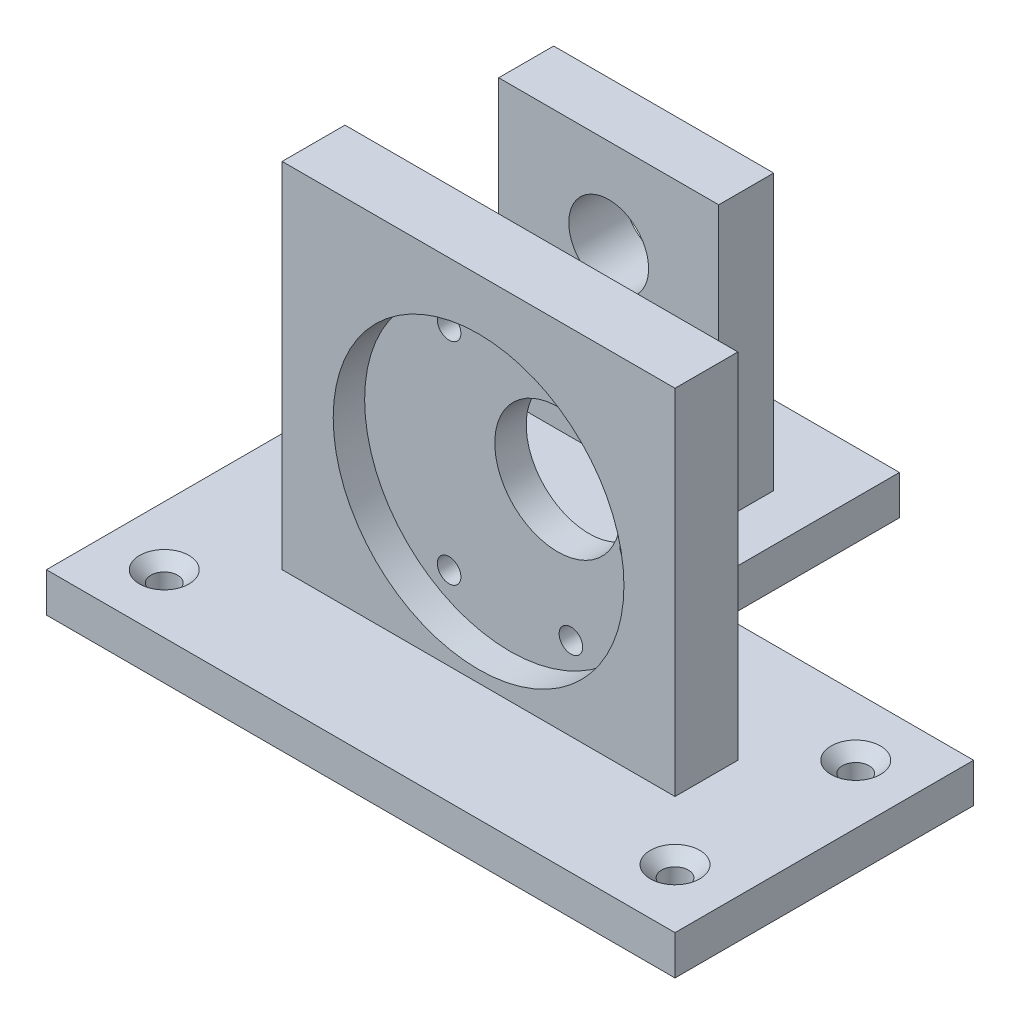
ISO-10303-21;
HEADER;
FILE_DESCRIPTION(('STEP AP214'),'2;1');
FILE_NAME('part.step','',(''),(''),'','','');
FILE_SCHEMA(('AUTOMOTIVE_DESIGN { 1 0 10303 214 1 1 1 1 }'));
ENDSEC;
DATA;
#1=APPLICATION_CONTEXT('core data for automotive mechanical design processes');
#2=APPLICATION_PROTOCOL_DEFINITION('international standard','automotive_design',2000,#1);
#3=PRODUCT_CONTEXT('',#1,'mechanical');
#4=PRODUCT('Part','Part','',(#3));
#5=PRODUCT_RELATED_PRODUCT_CATEGORY('part','',(#4));
#6=PRODUCT_DEFINITION_FORMATION('','',#4);
#7=PRODUCT_DEFINITION_CONTEXT('part definition',#1,'design');
#8=PRODUCT_DEFINITION('design','',#6,#7);
#9=PRODUCT_DEFINITION_SHAPE('','',#8);
#10=(LENGTH_UNIT() NAMED_UNIT(*) SI_UNIT(.MILLI.,.METRE.));
#11=(NAMED_UNIT(*) PLANE_ANGLE_UNIT() SI_UNIT($,.RADIAN.));
#12=(NAMED_UNIT(*) SI_UNIT($,.STERADIAN.) SOLID_ANGLE_UNIT());
#13=UNCERTAINTY_MEASURE_WITH_UNIT(LENGTH_MEASURE(1.E-05),#10,'distance_accuracy_value','');
#14=(GEOMETRIC_REPRESENTATION_CONTEXT(3) GLOBAL_UNCERTAINTY_ASSIGNED_CONTEXT((#13)) GLOBAL_UNIT_ASSIGNED_CONTEXT((#10,
#11,#12)) REPRESENTATION_CONTEXT('',''));
#15=CARTESIAN_POINT('',(0.,0.,0.));
#16=DIRECTION('',(0.,0.,1.));
#17=DIRECTION('',(1.,0.,0.));
#18=AXIS2_PLACEMENT_3D('',#15,#16,#17);
#19=CARTESIAN_POINT('',(0.,0.,-15.));
#20=DIRECTION('',(0.,0.,1.));
#21=DIRECTION('',(1.,0.,0.));
#22=AXIS2_PLACEMENT_3D('',#19,#20,#21);
#23=PLANE('',#22);
#24=DIRECTION('',(0.,-1.,0.));
#25=VECTOR('',#24,1.);
#26=CARTESIAN_POINT('',(3.56217782532956,0.,-15.));
#27=LINE('',#26,#25);
#28=CARTESIAN_POINT('',(3.56217782532956,5.00000000000001,-15.));
#29=VERTEX_POINT('',#28);
#30=CARTESIAN_POINT('',(3.56217782532956,0.,-15.));
#31=VERTEX_POINT('',#30);
#32=EDGE_CURVE('E235',#29,#31,#27,.T.);
#33=ORIENTED_EDGE('',*,*,#32,.F.);
#34=DIRECTION('',(-1.,0.,0.));
#35=VECTOR('',#34,1.);
#36=CARTESIAN_POINT('',(-40.,5.,-15.));
#37=LINE('',#36,#35);
#38=CARTESIAN_POINT('',(40.,5.00000000000002,-15.));
#39=VERTEX_POINT('',#38);
#40=EDGE_CURVE('E324',#39,#29,#37,.T.);
#41=ORIENTED_EDGE('',*,*,#40,.F.);
#42=DIRECTION('',(0.,1.,0.));
#43=VECTOR('',#42,1.);
#44=CARTESIAN_POINT('',(40.,5.00000000000002,-15.));
#45=LINE('',#44,#43);
#46=CARTESIAN_POINT('',(40.,0.,-15.));
#47=VERTEX_POINT('',#46);
#48=EDGE_CURVE('E319',#47,#39,#45,.T.);
#49=ORIENTED_EDGE('',*,*,#48,.F.);
#50=DIRECTION('',(1.,0.,0.));
#51=VECTOR('',#50,1.);
#52=CARTESIAN_POINT('',(-40.,0.,-15.));
#53=LINE('',#52,#51);
#54=EDGE_CURVE('E314',#31,#47,#53,.T.);
#55=ORIENTED_EDGE('',*,*,#54,.F.);
#56=EDGE_LOOP('',(#33,#41,#49,#55));
#57=FACE_BOUND('',#56,.T.);
#58=ADVANCED_FACE('F66',(#57),#23,.F.);
#59=CARTESIAN_POINT('',(-25.,50.,8.));
#60=DIRECTION('',(1.,0.,0.));
#61=DIRECTION('',(0.,1.,0.));
#62=AXIS2_PLACEMENT_3D('',#59,#60,#61);
#63=PLANE('',#62);
#64=DIRECTION('',(0.,0.,-1.));
#65=VECTOR('',#64,1.);
#66=CARTESIAN_POINT('',(-25.,5.,8.));
#67=LINE('',#66,#65);
#68=CARTESIAN_POINT('',(-25.,5.,8.));
#69=VERTEX_POINT('',#68);
#70=CARTESIAN_POINT('',(-25.,5.,0.));
#71=VERTEX_POINT('',#70);
#72=EDGE_CURVE('E359',#69,#71,#67,.T.);
#73=ORIENTED_EDGE('',*,*,#72,.F.);
#74=DIRECTION('',(0.,-1.,0.));
#75=VECTOR('',#74,1.);
#76=CARTESIAN_POINT('',(-25.,50.,8.));
#77=LINE('',#76,#75);
#78=CARTESIAN_POINT('',(-25.,50.,8.));
#79=VERTEX_POINT('',#78);
#80=EDGE_CURVE('E428',#79,#69,#77,.T.);
#81=ORIENTED_EDGE('',*,*,#80,.F.);
#82=DIRECTION('',(0.,0.,-1.));
#83=VECTOR('',#82,1.);
#84=CARTESIAN_POINT('',(-25.,50.,8.));
#85=LINE('',#84,#83);
#86=CARTESIAN_POINT('',(-25.,50.,0.));
#87=VERTEX_POINT('',#86);
#88=EDGE_CURVE('E443',#79,#87,#85,.T.);
#89=ORIENTED_EDGE('',*,*,#88,.T.);
#90=DIRECTION('',(0.,-1.,0.));
#91=VECTOR('',#90,1.);
#92=CARTESIAN_POINT('',(-25.,50.,0.));
#93=LINE('',#92,#91);
#94=EDGE_CURVE('E424',#87,#71,#93,.T.);
#95=ORIENTED_EDGE('',*,*,#94,.T.);
#96=EDGE_LOOP('',(#73,#81,#89,#95));
#97=FACE_BOUND('',#96,.T.);
#98=ADVANCED_FACE('F460',(#97),#63,.F.);
#99=CARTESIAN_POINT('',(25.,50.,8.));
#100=DIRECTION('',(1.,0.,0.));
#101=DIRECTION('',(0.,1.,0.));
#102=AXIS2_PLACEMENT_3D('',#99,#100,#101);
#103=PLANE('',#102);
#104=DIRECTION('',(0.,-1.,0.));
#105=VECTOR('',#104,1.);
#106=CARTESIAN_POINT('',(25.,50.,8.));
#107=LINE('',#106,#105);
#108=CARTESIAN_POINT('',(25.,50.,8.));
#109=VERTEX_POINT('',#108);
#110=CARTESIAN_POINT('',(25.,5.00000000000001,8.));
#111=VERTEX_POINT('',#110);
#112=EDGE_CURVE('E423',#109,#111,#107,.T.);
#113=ORIENTED_EDGE('',*,*,#112,.T.);
#114=DIRECTION('',(0.,0.,-1.));
#115=VECTOR('',#114,1.);
#116=CARTESIAN_POINT('',(25.,5.00000000000001,8.));
#117=LINE('',#116,#115);
#118=CARTESIAN_POINT('',(25.,5.00000000000001,0.));
#119=VERTEX_POINT('',#118);
#120=EDGE_CURVE('E355',#111,#119,#117,.T.);
#121=ORIENTED_EDGE('',*,*,#120,.T.);
#122=DIRECTION('',(0.,-1.,0.));
#123=VECTOR('',#122,1.);
#124=CARTESIAN_POINT('',(25.,50.,0.));
#125=LINE('',#124,#123);
#126=CARTESIAN_POINT('',(25.,50.,0.));
#127=VERTEX_POINT('',#126);
#128=EDGE_CURVE('E436',#127,#119,#125,.T.);
#129=ORIENTED_EDGE('',*,*,#128,.F.);
#130=DIRECTION('',(0.,0.,-1.));
#131=VECTOR('',#130,1.);
#132=CARTESIAN_POINT('',(25.,50.,8.));
#133=LINE('',#132,#131);
#134=EDGE_CURVE('E432',#109,#127,#133,.T.);
#135=ORIENTED_EDGE('',*,*,#134,.F.);
#136=EDGE_LOOP('',(#113,#121,#129,#135));
#137=FACE_BOUND('',#136,.T.);
#138=ADVANCED_FACE('F466',(#137),#103,.T.);
#139=CARTESIAN_POINT('',(0.,0.,8.));
#140=DIRECTION('',(0.,0.,-1.));
#141=DIRECTION('',(-1.,0.,0.));
#142=AXIS2_PLACEMENT_3D('',#139,#140,#141);
#143=PLANE('',#142);
#144=CARTESIAN_POINT('',(0.,25.,8.));
#145=DIRECTION('',(0.,0.,1.));
#146=DIRECTION('',(1.,0.,0.));
#147=AXIS2_PLACEMENT_3D('',#144,#145,#146);
#148=CIRCLE('',#147,18.5);
#149=CARTESIAN_POINT('',(18.5,25.,8.));
#150=VERTEX_POINT('',#149);
#151=EDGE_CURVE('E365',#150,#150,#148,.T.);
#152=ORIENTED_EDGE('',*,*,#151,.F.);
#153=EDGE_LOOP('',(#152));
#154=FACE_BOUND('',#153,.T.);
#155=DIRECTION('',(-1.,0.,0.));
#156=VECTOR('',#155,1.);
#157=CARTESIAN_POINT('',(0.,5.00000000000001,8.));
#158=LINE('',#157,#156);
#159=EDGE_CURVE('E362',#111,#69,#158,.T.);
#160=ORIENTED_EDGE('',*,*,#159,.F.);
#161=ORIENTED_EDGE('',*,*,#112,.F.);
#162=DIRECTION('',(1.,0.,0.));
#163=VECTOR('',#162,1.);
#164=CARTESIAN_POINT('',(-25.,50.,8.));
#165=LINE('',#164,#163);
#166=EDGE_CURVE('E419',#79,#109,#165,.T.);
#167=ORIENTED_EDGE('',*,*,#166,.F.);
#168=ORIENTED_EDGE('',*,*,#80,.T.);
#169=EDGE_LOOP('',(#160,#161,#167,#168));
#170=FACE_BOUND('',#169,.T.);
#171=ADVANCED_FACE('F469',(#154,#170),#143,.F.);
#172=CARTESIAN_POINT('',(0.,0.,0.));
#173=DIRECTION('',(0.,0.,-1.));
#174=DIRECTION('',(-1.,0.,0.));
#175=AXIS2_PLACEMENT_3D('',#172,#173,#174);
#176=PLANE('',#175);
#177=CARTESIAN_POINT('',(-16.4378221746704,28.4999999993294,0.));
#178=DIRECTION('',(0.,0.,-1.));
#179=DIRECTION('',(-1.,0.,0.));
#180=AXIS2_PLACEMENT_3D('',#177,#178,#179);
#181=CIRCLE('',#180,6.08);
#182=CARTESIAN_POINT('',(-22.5178221746704,28.4999999993294,0.));
#183=VERTEX_POINT('',#182);
#184=EDGE_CURVE('E254',#183,#183,#181,.T.);
#185=ORIENTED_EDGE('',*,*,#184,.F.);
#186=EDGE_LOOP('',(#185));
#187=FACE_BOUND('',#186,.T.);
#188=CARTESIAN_POINT('',(-7.74999999999999,38.4233937586588,0.));
#189=DIRECTION('',(0.,0.,1.));
#190=DIRECTION('',(1.,0.,0.));
#191=AXIS2_PLACEMENT_3D('',#188,#189,#190);
#192=CIRCLE('',#191,1.50000000039213);
#193=CARTESIAN_POINT('',(-6.24999999960786,38.4233937586588,0.));
#194=VERTEX_POINT('',#193);
#195=EDGE_CURVE('E399',#194,#194,#192,.T.);
#196=ORIENTED_EDGE('',*,*,#195,.T.);
#197=EDGE_LOOP('',(#196));
#198=FACE_BOUND('',#197,.T.);
#199=CARTESIAN_POINT('',(-7.74999999999999,11.5766062413412,0.));
#200=DIRECTION('',(0.,0.,1.));
#201=DIRECTION('',(1.,0.,0.));
#202=AXIS2_PLACEMENT_3D('',#199,#200,#201);
#203=CIRCLE('',#202,1.50000000039213);
#204=CARTESIAN_POINT('',(-6.24999999960786,11.5766062413412,0.));
#205=VERTEX_POINT('',#204);
#206=EDGE_CURVE('E404',#205,#205,#203,.T.);
#207=ORIENTED_EDGE('',*,*,#206,.T.);
#208=EDGE_LOOP('',(#207));
#209=FACE_BOUND('',#208,.T.);
#210=CARTESIAN_POINT('',(7.75000000000001,11.5766062413412,0.));
#211=DIRECTION('',(0.,0.,1.));
#212=DIRECTION('',(1.,0.,0.));
#213=AXIS2_PLACEMENT_3D('',#210,#211,#212);
#214=CIRCLE('',#213,1.50000000039213);
#215=CARTESIAN_POINT('',(9.25000000039214,11.5766062413412,0.));
#216=VERTEX_POINT('',#215);
#217=EDGE_CURVE('E408',#216,#216,#214,.T.);
#218=ORIENTED_EDGE('',*,*,#217,.T.);
#219=EDGE_LOOP('',(#218));
#220=FACE_BOUND('',#219,.T.);
#221=CARTESIAN_POINT('',(15.5,25.,0.));
#222=DIRECTION('',(0.,0.,1.));
#223=DIRECTION('',(1.,0.,0.));
#224=AXIS2_PLACEMENT_3D('',#221,#222,#223);
#225=CIRCLE('',#224,1.50000000039213);
#226=CARTESIAN_POINT('',(17.0000000003921,25.,0.));
#227=VERTEX_POINT('',#226);
#228=EDGE_CURVE('E398',#227,#227,#225,.T.);
#229=ORIENTED_EDGE('',*,*,#228,.T.);
#230=EDGE_LOOP('',(#229));
#231=FACE_BOUND('',#230,.T.);
#232=CARTESIAN_POINT('',(6.06217782532956,28.4999999993294,0.));
#233=DIRECTION('',(0.,0.,1.));
#234=DIRECTION('',(1.,0.,0.));
#235=AXIS2_PLACEMENT_3D('',#232,#233,#234);
#236=CIRCLE('',#235,8.00000000000001);
#237=CARTESIAN_POINT('',(14.0621778253296,28.4999999993294,0.));
#238=VERTEX_POINT('',#237);
#239=EDGE_CURVE('E394',#238,#238,#236,.T.);
#240=ORIENTED_EDGE('',*,*,#239,.T.);
#241=EDGE_LOOP('',(#240));
#242=FACE_BOUND('',#241,.T.);
#243=CARTESIAN_POINT('',(7.74999999999999,38.4233937586588,0.));
#244=DIRECTION('',(0.,0.,1.));
#245=DIRECTION('',(1.,0.,0.));
#246=AXIS2_PLACEMENT_3D('',#243,#244,#245);
#247=CIRCLE('',#246,1.50000000039214);
#248=CARTESIAN_POINT('',(9.25000000039213,38.4233937586588,0.));
#249=VERTEX_POINT('',#248);
#250=EDGE_CURVE('E403',#249,#249,#247,.T.);
#251=ORIENTED_EDGE('',*,*,#250,.T.);
#252=EDGE_LOOP('',(#251));
#253=FACE_BOUND('',#252,.T.);
#254=ORIENTED_EDGE('',*,*,#128,.T.);
#255=DIRECTION('',(-1.,0.,0.));
#256=VECTOR('',#255,1.);
#257=CARTESIAN_POINT('',(0.,5.00000000000001,0.));
#258=LINE('',#257,#256);
#259=EDGE_CURVE('E75',#119,#71,#258,.T.);
#260=ORIENTED_EDGE('',*,*,#259,.T.);
#261=ORIENTED_EDGE('',*,*,#94,.F.);
#262=DIRECTION('',(1.,0.,0.));
#263=VECTOR('',#262,1.);
#264=CARTESIAN_POINT('',(-25.,50.,0.));
#265=LINE('',#264,#263);
#266=EDGE_CURVE('E418',#87,#127,#265,.T.);
#267=ORIENTED_EDGE('',*,*,#266,.T.);
#268=EDGE_LOOP('',(#254,#260,#261,#267));
#269=FACE_BOUND('',#268,.T.);
#270=ADVANCED_FACE('F454',(#187,#198,#209,#220,#231,#242,#253,#269),#176,.T.);
#271=CARTESIAN_POINT('',(7.74999999999999,38.4233937586588,10.));
#272=DIRECTION('',(0.,0.,-1.));
#273=DIRECTION('',(-1.,0.,0.));
#274=AXIS2_PLACEMENT_3D('',#271,#272,#273);
#275=CYLINDRICAL_SURFACE('',#274,1.50000000039214);
#276=ORIENTED_EDGE('',*,*,#250,.F.);
#277=EDGE_LOOP('',(#276));
#278=FACE_BOUND('',#277,.T.);
#279=CARTESIAN_POINT('',(7.74999999999999,38.4233937586588,4.));
#280=DIRECTION('',(0.,0.,1.));
#281=DIRECTION('',(1.,0.,0.));
#282=AXIS2_PLACEMENT_3D('',#279,#280,#281);
#283=CIRCLE('',#282,1.50000000039214);
#284=CARTESIAN_POINT('',(9.25000000039213,38.4233937586588,4.));
#285=VERTEX_POINT('',#284);
#286=EDGE_CURVE('E390',#285,#285,#283,.T.);
#287=ORIENTED_EDGE('',*,*,#286,.T.);
#288=EDGE_LOOP('',(#287));
#289=FACE_BOUND('',#288,.T.);
#290=ADVANCED_FACE('F477',(#278,#289),#275,.F.);
#291=CARTESIAN_POINT('',(6.06217782532956,28.4999999993294,10.));
#292=DIRECTION('',(0.,0.,-1.));
#293=DIRECTION('',(-1.,0.,0.));
#294=AXIS2_PLACEMENT_3D('',#291,#292,#293);
#295=CYLINDRICAL_SURFACE('',#294,8.00000000000001);
#296=ORIENTED_EDGE('',*,*,#239,.F.);
#297=EDGE_LOOP('',(#296));
#298=FACE_BOUND('',#297,.T.);
#299=CARTESIAN_POINT('',(6.06217782532956,28.4999999993294,4.));
#300=DIRECTION('',(0.,0.,1.));
#301=DIRECTION('',(1.,0.,0.));
#302=AXIS2_PLACEMENT_3D('',#299,#300,#301);
#303=CIRCLE('',#302,8.00000000000001);
#304=CARTESIAN_POINT('',(14.0621778253296,28.4999999993294,4.));
#305=VERTEX_POINT('',#304);
#306=EDGE_CURVE('E386',#305,#305,#303,.T.);
#307=ORIENTED_EDGE('',*,*,#306,.T.);
#308=EDGE_LOOP('',(#307));
#309=FACE_BOUND('',#308,.T.);
#310=ADVANCED_FACE('F546',(#298,#309),#295,.F.);
#311=CARTESIAN_POINT('',(15.5,25.,10.));
#312=DIRECTION('',(0.,0.,-1.));
#313=DIRECTION('',(-1.,0.,0.));
#314=AXIS2_PLACEMENT_3D('',#311,#312,#313);
#315=CYLINDRICAL_SURFACE('',#314,1.50000000039213);
#316=ORIENTED_EDGE('',*,*,#228,.F.);
#317=EDGE_LOOP('',(#316));
#318=FACE_BOUND('',#317,.T.);
#319=CARTESIAN_POINT('',(15.5,25.,4.));
#320=DIRECTION('',(0.,0.,1.));
#321=DIRECTION('',(1.,0.,0.));
#322=AXIS2_PLACEMENT_3D('',#319,#320,#321);
#323=CIRCLE('',#322,1.50000000039213);
#324=CARTESIAN_POINT('',(17.0000000003921,25.,4.));
#325=VERTEX_POINT('',#324);
#326=EDGE_CURVE('E382',#325,#325,#323,.T.);
#327=ORIENTED_EDGE('',*,*,#326,.T.);
#328=EDGE_LOOP('',(#327));
#329=FACE_BOUND('',#328,.T.);
#330=ADVANCED_FACE('F549',(#318,#329),#315,.F.);
#331=CARTESIAN_POINT('',(7.75000000000001,11.5766062413412,10.));
#332=DIRECTION('',(0.,0.,-1.));
#333=DIRECTION('',(-1.,0.,0.));
#334=AXIS2_PLACEMENT_3D('',#331,#332,#333);
#335=CYLINDRICAL_SURFACE('',#334,1.50000000039213);
#336=ORIENTED_EDGE('',*,*,#217,.F.);
#337=EDGE_LOOP('',(#336));
#338=FACE_BOUND('',#337,.T.);
#339=CARTESIAN_POINT('',(7.75000000000001,11.5766062413412,4.));
#340=DIRECTION('',(0.,0.,1.));
#341=DIRECTION('',(1.,0.,0.));
#342=AXIS2_PLACEMENT_3D('',#339,#340,#341);
#343=CIRCLE('',#342,1.50000000039213);
#344=CARTESIAN_POINT('',(9.25000000039214,11.5766062413412,4.));
#345=VERTEX_POINT('',#344);
#346=EDGE_CURVE('E378',#345,#345,#343,.T.);
#347=ORIENTED_EDGE('',*,*,#346,.T.);
#348=EDGE_LOOP('',(#347));
#349=FACE_BOUND('',#348,.T.);
#350=ADVANCED_FACE('F558',(#338,#349),#335,.F.);
#351=CARTESIAN_POINT('',(-7.74999999999999,11.5766062413412,10.));
#352=DIRECTION('',(0.,0.,-1.));
#353=DIRECTION('',(-1.,0.,0.));
#354=AXIS2_PLACEMENT_3D('',#351,#352,#353);
#355=CYLINDRICAL_SURFACE('',#354,1.50000000039213);
#356=ORIENTED_EDGE('',*,*,#206,.F.);
#357=EDGE_LOOP('',(#356));
#358=FACE_BOUND('',#357,.T.);
#359=CARTESIAN_POINT('',(-7.74999999999999,11.5766062413412,4.));
#360=DIRECTION('',(0.,0.,1.));
#361=DIRECTION('',(1.,0.,0.));
#362=AXIS2_PLACEMENT_3D('',#359,#360,#361);
#363=CIRCLE('',#362,1.50000000039213);
#364=CARTESIAN_POINT('',(-6.24999999960786,11.5766062413412,4.));
#365=VERTEX_POINT('',#364);
#366=EDGE_CURVE('E374',#365,#365,#363,.T.);
#367=ORIENTED_EDGE('',*,*,#366,.T.);
#368=EDGE_LOOP('',(#367));
#369=FACE_BOUND('',#368,.T.);
#370=ADVANCED_FACE('F554',(#358,#369),#355,.F.);
#371=CARTESIAN_POINT('',(-7.74999999999999,38.4233937586588,10.));
#372=DIRECTION('',(0.,0.,-1.));
#373=DIRECTION('',(-1.,0.,0.));
#374=AXIS2_PLACEMENT_3D('',#371,#372,#373);
#375=CYLINDRICAL_SURFACE('',#374,1.50000000039213);
#376=ORIENTED_EDGE('',*,*,#195,.F.);
#377=EDGE_LOOP('',(#376));
#378=FACE_BOUND('',#377,.T.);
#379=CARTESIAN_POINT('',(-7.74999999999999,38.4233937586588,4.));
#380=DIRECTION('',(0.,0.,1.));
#381=DIRECTION('',(1.,0.,0.));
#382=AXIS2_PLACEMENT_3D('',#379,#380,#381);
#383=CIRCLE('',#382,1.50000000039213);
#384=CARTESIAN_POINT('',(-6.24999999960786,38.4233937586588,4.));
#385=VERTEX_POINT('',#384);
#386=EDGE_CURVE('E370',#385,#385,#383,.T.);
#387=ORIENTED_EDGE('',*,*,#386,.T.);
#388=EDGE_LOOP('',(#387));
#389=FACE_BOUND('',#388,.T.);
#390=ADVANCED_FACE('F551',(#378,#389),#375,.F.);
#391=CARTESIAN_POINT('',(-25.,50.,8.));
#392=DIRECTION('',(0.,1.,0.));
#393=DIRECTION('',(-1.,0.,0.));
#394=AXIS2_PLACEMENT_3D('',#391,#392,#393);
#395=PLANE('',#394);
#396=ORIENTED_EDGE('',*,*,#266,.F.);
#397=ORIENTED_EDGE('',*,*,#88,.F.);
#398=ORIENTED_EDGE('',*,*,#166,.T.);
#399=ORIENTED_EDGE('',*,*,#134,.T.);
#400=EDGE_LOOP('',(#396,#397,#398,#399));
#401=FACE_BOUND('',#400,.T.);
#402=ADVANCED_FACE('F68',(#401),#395,.T.);
#403=CARTESIAN_POINT('',(0.,25.,4.));
#404=DIRECTION('',(0.,0.,1.));
#405=DIRECTION('',(1.,0.,0.));
#406=AXIS2_PLACEMENT_3D('',#403,#404,#405);
#407=CYLINDRICAL_SURFACE('',#406,18.5);
#408=CARTESIAN_POINT('',(0.,25.,4.));
#409=DIRECTION('',(0.,0.,1.));
#410=DIRECTION('',(1.,0.,0.));
#411=AXIS2_PLACEMENT_3D('',#408,#409,#410);
#412=CIRCLE('',#411,18.5);
#413=CARTESIAN_POINT('',(18.5,25.,4.));
#414=VERTEX_POINT('',#413);
#415=EDGE_CURVE('E366',#414,#414,#412,.T.);
#416=ORIENTED_EDGE('',*,*,#415,.F.);
#417=EDGE_LOOP('',(#416));
#418=FACE_BOUND('',#417,.T.);
#419=ORIENTED_EDGE('',*,*,#151,.T.);
#420=EDGE_LOOP('',(#419));
#421=FACE_BOUND('',#420,.T.);
#422=ADVANCED_FACE('F541',(#418,#421),#407,.F.);
#423=CARTESIAN_POINT('',(0.,25.,4.));
#424=DIRECTION('',(0.,0.,1.));
#425=DIRECTION('',(1.,0.,0.));
#426=AXIS2_PLACEMENT_3D('',#423,#424,#425);
#427=PLANE('',#426);
#428=ORIENTED_EDGE('',*,*,#286,.F.);
#429=EDGE_LOOP('',(#428));
#430=FACE_BOUND('',#429,.T.);
#431=ORIENTED_EDGE('',*,*,#306,.F.);
#432=EDGE_LOOP('',(#431));
#433=FACE_BOUND('',#432,.T.);
#434=ORIENTED_EDGE('',*,*,#326,.F.);
#435=EDGE_LOOP('',(#434));
#436=FACE_BOUND('',#435,.T.);
#437=ORIENTED_EDGE('',*,*,#346,.F.);
#438=EDGE_LOOP('',(#437));
#439=FACE_BOUND('',#438,.T.);
#440=ORIENTED_EDGE('',*,*,#366,.F.);
#441=EDGE_LOOP('',(#440));
#442=FACE_BOUND('',#441,.T.);
#443=ORIENTED_EDGE('',*,*,#386,.F.);
#444=EDGE_LOOP('',(#443));
#445=FACE_BOUND('',#444,.T.);
#446=ORIENTED_EDGE('',*,*,#415,.T.);
#447=EDGE_LOOP('',(#446));
#448=FACE_BOUND('',#447,.T.);
#449=ADVANCED_FACE('F536',(#430,#433,#436,#439,#442,#445,#448),#427,.T.);
#450=CARTESIAN_POINT('',(-40.,5.,23.));
#451=DIRECTION('',(0.,-1.,0.));
#452=DIRECTION('',(1.,0.,0.));
#453=AXIS2_PLACEMENT_3D('',#450,#451,#452);
#454=PLANE('',#453);
#455=DIRECTION('',(-1.,0.,0.));
#456=VECTOR('',#455,1.);
#457=CARTESIAN_POINT('',(-2.43782217467043,5.00000000000001,-25.));
#458=LINE('',#457,#456);
#459=CARTESIAN_POINT('',(-2.43782217467043,5.00000000000001,-25.));
#460=VERTEX_POINT('',#459);
#461=CARTESIAN_POINT('',(-30.4378221746704,5.00000000000001,-25.));
#462=VERTEX_POINT('',#461);
#463=EDGE_CURVE('E208',#460,#462,#458,.T.);
#464=ORIENTED_EDGE('',*,*,#463,.T.);
#465=DIRECTION('',(0.,0.,1.));
#466=VECTOR('',#465,1.);
#467=CARTESIAN_POINT('',(-30.4378221746704,5.00000000000001,-32.));
#468=LINE('',#467,#466);
#469=CARTESIAN_POINT('',(-30.4378221746704,5.00000000000001,-32.));
#470=VERTEX_POINT('',#469);
#471=EDGE_CURVE('E199',#470,#462,#468,.T.);
#472=ORIENTED_EDGE('',*,*,#471,.F.);
#473=DIRECTION('',(-1.,0.,0.));
#474=VECTOR('',#473,1.);
#475=CARTESIAN_POINT('',(-2.43782217467043,5.00000000000001,-32.));
#476=LINE('',#475,#474);
#477=CARTESIAN_POINT('',(-2.43782217467043,5.00000000000001,-32.));
#478=VERTEX_POINT('',#477);
#479=EDGE_CURVE('E182',#478,#470,#476,.T.);
#480=ORIENTED_EDGE('',*,*,#479,.F.);
#481=DIRECTION('',(0.,0.,1.));
#482=VECTOR('',#481,1.);
#483=CARTESIAN_POINT('',(-2.43782217467043,5.00000000000001,-32.));
#484=LINE('',#483,#482);
#485=EDGE_CURVE('E1077',#478,#460,#484,.T.);
#486=ORIENTED_EDGE('',*,*,#485,.T.);
#487=EDGE_LOOP('',(#464,#472,#480,#486));
#488=FACE_BOUND('',#487,.T.);
#489=CARTESIAN_POINT('',(-32.5,5.,-7.5));
#490=DIRECTION('',(0.,1.,0.));
#491=DIRECTION('',(0.,0.,1.));
#492=AXIS2_PLACEMENT_3D('',#489,#490,#491);
#493=CIRCLE('',#492,3.15);
#494=CARTESIAN_POINT('',(-32.5,5.,-4.35));
#495=VERTEX_POINT('',#494);
#496=EDGE_CURVE('E259',#495,#495,#493,.T.);
#497=ORIENTED_EDGE('',*,*,#496,.F.);
#498=EDGE_LOOP('',(#497));
#499=FACE_BOUND('',#498,.T.);
#500=CARTESIAN_POINT('',(-32.5,5.,15.5));
#501=DIRECTION('',(0.,1.,0.));
#502=DIRECTION('',(0.,0.,1.));
#503=AXIS2_PLACEMENT_3D('',#500,#501,#502);
#504=CIRCLE('',#503,3.15);
#505=CARTESIAN_POINT('',(-32.5,5.,18.65));
#506=VERTEX_POINT('',#505);
#507=EDGE_CURVE('E274',#506,#506,#504,.T.);
#508=ORIENTED_EDGE('',*,*,#507,.F.);
#509=EDGE_LOOP('',(#508));
#510=FACE_BOUND('',#509,.T.);
#511=CARTESIAN_POINT('',(32.5,5.00000000000002,15.5));
#512=DIRECTION('',(0.,1.,0.));
#513=DIRECTION('',(0.,0.,1.));
#514=AXIS2_PLACEMENT_3D('',#511,#512,#513);
#515=CIRCLE('',#514,3.15);
#516=CARTESIAN_POINT('',(32.5,5.00000000000002,18.65));
#517=VERTEX_POINT('',#516);
#518=EDGE_CURVE('E286',#517,#517,#515,.T.);
#519=ORIENTED_EDGE('',*,*,#518,.F.);
#520=EDGE_LOOP('',(#519));
#521=FACE_BOUND('',#520,.T.);
#522=CARTESIAN_POINT('',(32.5,5.00000000000002,-7.5));
#523=DIRECTION('',(0.,1.,0.));
#524=DIRECTION('',(0.,0.,1.));
#525=AXIS2_PLACEMENT_3D('',#522,#523,#524);
#526=CIRCLE('',#525,3.15);
#527=CARTESIAN_POINT('',(32.5,5.00000000000002,-4.35));
#528=VERTEX_POINT('',#527);
#529=EDGE_CURVE('E298',#528,#528,#526,.T.);
#530=ORIENTED_EDGE('',*,*,#529,.F.);
#531=EDGE_LOOP('',(#530));
#532=FACE_BOUND('',#531,.T.);
#533=DIRECTION('',(0.,0.,-1.));
#534=VECTOR('',#533,1.);
#535=CARTESIAN_POINT('',(40.,5.00000000000002,23.));
#536=LINE('',#535,#534);
#537=CARTESIAN_POINT('',(40.,5.00000000000002,23.));
#538=VERTEX_POINT('',#537);
#539=EDGE_CURVE('E345',#538,#39,#536,.T.);
#540=ORIENTED_EDGE('',*,*,#539,.T.);
#541=ORIENTED_EDGE('',*,*,#40,.T.);
#542=DIRECTION('',(0.,0.,1.));
#543=VECTOR('',#542,1.);
#544=CARTESIAN_POINT('',(3.56217782532956,5.00000000000001,-25.));
#545=LINE('',#544,#543);
#546=CARTESIAN_POINT('',(3.56217782532956,5.00000000000001,-42.));
#547=VERTEX_POINT('',#546);
#548=EDGE_CURVE('E242',#547,#29,#545,.T.);
#549=ORIENTED_EDGE('',*,*,#548,.F.);
#550=DIRECTION('',(1.,0.,0.));
#551=VECTOR('',#550,1.);
#552=CARTESIAN_POINT('',(3.56217782532956,5.00000000000001,-42.));
#553=LINE('',#552,#551);
#554=CARTESIAN_POINT('',(-36.4378221746704,5.00000000000001,-42.));
#555=VERTEX_POINT('',#554);
#556=EDGE_CURVE('E228',#555,#547,#553,.T.);
#557=ORIENTED_EDGE('',*,*,#556,.F.);
#558=DIRECTION('',(0.,0.,1.));
#559=VECTOR('',#558,1.);
#560=CARTESIAN_POINT('',(-36.4378221746704,5.,-25.));
#561=LINE('',#560,#559);
#562=CARTESIAN_POINT('',(-36.4378221746704,5.,-15.));
#563=VERTEX_POINT('',#562);
#564=EDGE_CURVE('E245',#555,#563,#561,.T.);
#565=ORIENTED_EDGE('',*,*,#564,.T.);
#566=CARTESIAN_POINT('',(-40.,5.,-15.));
#567=VERTEX_POINT('',#566);
#568=EDGE_CURVE('E323',#563,#567,#37,.T.);
#569=ORIENTED_EDGE('',*,*,#568,.T.);
#570=DIRECTION('',(0.,0.,-1.));
#571=VECTOR('',#570,1.);
#572=CARTESIAN_POINT('',(-40.,5.,23.));
#573=LINE('',#572,#571);
#574=CARTESIAN_POINT('',(-40.,5.,23.));
#575=VERTEX_POINT('',#574);
#576=EDGE_CURVE('E341',#575,#567,#573,.T.);
#577=ORIENTED_EDGE('',*,*,#576,.F.);
#578=DIRECTION('',(-1.,0.,0.));
#579=VECTOR('',#578,1.);
#580=CARTESIAN_POINT('',(-40.,5.,23.));
#581=LINE('',#580,#579);
#582=EDGE_CURVE('E338',#538,#575,#581,.T.);
#583=ORIENTED_EDGE('',*,*,#582,.F.);
#584=EDGE_LOOP('',(#540,#541,#549,#557,#565,#569,#577,#583));
#585=FACE_BOUND('',#584,.T.);
#586=ORIENTED_EDGE('',*,*,#120,.F.);
#587=ORIENTED_EDGE('',*,*,#159,.T.);
#588=ORIENTED_EDGE('',*,*,#72,.T.);
#589=ORIENTED_EDGE('',*,*,#259,.F.);
#590=EDGE_LOOP('',(#586,#587,#588,#589));
#591=FACE_BOUND('',#590,.T.);
#592=ADVANCED_FACE('F206',(#488,#499,#510,#521,#532,#585,#591),#454,.F.);
#593=CARTESIAN_POINT('',(-40.,5.,23.));
#594=DIRECTION('',(1.,0.,0.));
#595=DIRECTION('',(0.,0.,-1.));
#596=AXIS2_PLACEMENT_3D('',#593,#594,#595);
#597=PLANE('',#596);
#598=ORIENTED_EDGE('',*,*,#576,.T.);
#599=DIRECTION('',(0.,-1.,0.));
#600=VECTOR('',#599,1.);
#601=CARTESIAN_POINT('',(-40.,5.,-15.));
#602=LINE('',#601,#600);
#603=CARTESIAN_POINT('',(-40.,0.,-15.));
#604=VERTEX_POINT('',#603);
#605=EDGE_CURVE('E310',#567,#604,#602,.T.);
#606=ORIENTED_EDGE('',*,*,#605,.T.);
#607=DIRECTION('',(0.,0.,-1.));
#608=VECTOR('',#607,1.);
#609=CARTESIAN_POINT('',(-40.,0.,23.));
#610=LINE('',#609,#608);
#611=CARTESIAN_POINT('',(-40.,0.,23.));
#612=VERTEX_POINT('',#611);
#613=EDGE_CURVE('E352',#612,#604,#610,.T.);
#614=ORIENTED_EDGE('',*,*,#613,.F.);
#615=DIRECTION('',(0.,-1.,0.));
#616=VECTOR('',#615,1.);
#617=CARTESIAN_POINT('',(-40.,5.,23.));
#618=LINE('',#617,#616);
#619=EDGE_CURVE('E328',#575,#612,#618,.T.);
#620=ORIENTED_EDGE('',*,*,#619,.F.);
#621=EDGE_LOOP('',(#598,#606,#614,#620));
#622=FACE_BOUND('',#621,.T.);
#623=ADVANCED_FACE('F528',(#622),#597,.F.);
#624=CARTESIAN_POINT('',(40.,5.00000000000002,23.));
#625=DIRECTION('',(-1.,0.,0.));
#626=DIRECTION('',(0.,0.,1.));
#627=AXIS2_PLACEMENT_3D('',#624,#625,#626);
#628=PLANE('',#627);
#629=DIRECTION('',(0.,0.,-1.));
#630=VECTOR('',#629,1.);
#631=CARTESIAN_POINT('',(40.,0.,23.));
#632=LINE('',#631,#630);
#633=CARTESIAN_POINT('',(40.,0.,23.));
#634=VERTEX_POINT('',#633);
#635=EDGE_CURVE('E348',#634,#47,#632,.T.);
#636=ORIENTED_EDGE('',*,*,#635,.T.);
#637=ORIENTED_EDGE('',*,*,#48,.T.);
#638=ORIENTED_EDGE('',*,*,#539,.F.);
#639=DIRECTION('',(0.,1.,0.));
#640=VECTOR('',#639,1.);
#641=CARTESIAN_POINT('',(40.,5.00000000000002,23.));
#642=LINE('',#641,#640);
#643=EDGE_CURVE('E335',#634,#538,#642,.T.);
#644=ORIENTED_EDGE('',*,*,#643,.F.);
#645=EDGE_LOOP('',(#636,#637,#638,#644));
#646=FACE_BOUND('',#645,.T.);
#647=ADVANCED_FACE('F505',(#646),#628,.F.);
#648=CARTESIAN_POINT('',(0.,0.,23.));
#649=DIRECTION('',(0.,0.,1.));
#650=DIRECTION('',(1.,0.,0.));
#651=AXIS2_PLACEMENT_3D('',#648,#649,#650);
#652=PLANE('',#651);
#653=ORIENTED_EDGE('',*,*,#619,.T.);
#654=DIRECTION('',(1.,0.,0.));
#655=VECTOR('',#654,1.);
#656=CARTESIAN_POINT('',(-40.,0.,23.));
#657=LINE('',#656,#655);
#658=EDGE_CURVE('E332',#612,#634,#657,.T.);
#659=ORIENTED_EDGE('',*,*,#658,.T.);
#660=ORIENTED_EDGE('',*,*,#643,.T.);
#661=ORIENTED_EDGE('',*,*,#582,.T.);
#662=EDGE_LOOP('',(#653,#659,#660,#661));
#663=FACE_BOUND('',#662,.T.);
#664=ADVANCED_FACE('F496',(#663),#652,.T.);
#665=ORIENTED_EDGE('',*,*,#568,.F.);
#666=DIRECTION('',(0.,-1.,0.));
#667=VECTOR('',#666,1.);
#668=CARTESIAN_POINT('',(-36.4378221746704,0.,-15.));
#669=LINE('',#668,#667);
#670=CARTESIAN_POINT('',(-36.4378221746704,0.,-15.));
#671=VERTEX_POINT('',#670);
#672=EDGE_CURVE('E232',#563,#671,#669,.T.);
#673=ORIENTED_EDGE('',*,*,#672,.T.);
#674=EDGE_CURVE('E315',#604,#671,#53,.T.);
#675=ORIENTED_EDGE('',*,*,#674,.F.);
#676=ORIENTED_EDGE('',*,*,#605,.F.);
#677=EDGE_LOOP('',(#665,#673,#675,#676));
#678=FACE_BOUND('',#677,.T.);
#679=ADVANCED_FACE('F486',(#678),#23,.F.);
#680=CARTESIAN_POINT('',(-25.,0.,8.));
#681=DIRECTION('',(0.,1.,0.));
#682=DIRECTION('',(-1.,0.,0.));
#683=AXIS2_PLACEMENT_3D('',#680,#681,#682);
#684=PLANE('',#683);
#685=CARTESIAN_POINT('',(-32.5,0.,-7.5));
#686=DIRECTION('',(0.,1.,0.));
#687=DIRECTION('',(0.,0.,1.));
#688=AXIS2_PLACEMENT_3D('',#685,#686,#687);
#689=CIRCLE('',#688,1.69999999999999);
#690=CARTESIAN_POINT('',(-32.5,0.,-5.80000000000001));
#691=VERTEX_POINT('',#690);
#692=EDGE_CURVE('E270',#691,#691,#689,.T.);
#693=ORIENTED_EDGE('',*,*,#692,.T.);
#694=EDGE_LOOP('',(#693));
#695=FACE_BOUND('',#694,.T.);
#696=CARTESIAN_POINT('',(-32.5,0.,15.5));
#697=DIRECTION('',(0.,1.,0.));
#698=DIRECTION('',(0.,0.,1.));
#699=AXIS2_PLACEMENT_3D('',#696,#697,#698);
#700=CIRCLE('',#699,1.69999999999999);
#701=CARTESIAN_POINT('',(-32.5,0.,17.2));
#702=VERTEX_POINT('',#701);
#703=EDGE_CURVE('E282',#702,#702,#700,.T.);
#704=ORIENTED_EDGE('',*,*,#703,.T.);
#705=EDGE_LOOP('',(#704));
#706=FACE_BOUND('',#705,.T.);
#707=CARTESIAN_POINT('',(32.5,0.,15.5));
#708=DIRECTION('',(0.,1.,0.));
#709=DIRECTION('',(0.,0.,1.));
#710=AXIS2_PLACEMENT_3D('',#707,#708,#709);
#711=CIRCLE('',#710,1.69999999999999);
#712=CARTESIAN_POINT('',(32.5,0.,17.2));
#713=VERTEX_POINT('',#712);
#714=EDGE_CURVE('E294',#713,#713,#711,.T.);
#715=ORIENTED_EDGE('',*,*,#714,.T.);
#716=EDGE_LOOP('',(#715));
#717=FACE_BOUND('',#716,.T.);
#718=CARTESIAN_POINT('',(32.5,0.,-7.5));
#719=DIRECTION('',(0.,1.,0.));
#720=DIRECTION('',(0.,0.,1.));
#721=AXIS2_PLACEMENT_3D('',#718,#719,#720);
#722=CIRCLE('',#721,1.69999999999999);
#723=CARTESIAN_POINT('',(32.5,0.,-5.80000000000001));
#724=VERTEX_POINT('',#723);
#725=EDGE_CURVE('E306',#724,#724,#722,.T.);
#726=ORIENTED_EDGE('',*,*,#725,.T.);
#727=EDGE_LOOP('',(#726));
#728=FACE_BOUND('',#727,.T.);
#729=ORIENTED_EDGE('',*,*,#613,.T.);
#730=ORIENTED_EDGE('',*,*,#674,.T.);
#731=DIRECTION('',(0.,0.,1.));
#732=VECTOR('',#731,1.);
#733=CARTESIAN_POINT('',(-36.4378221746704,0.,-25.));
#734=LINE('',#733,#732);
#735=CARTESIAN_POINT('',(-36.4378221746704,0.,-42.));
#736=VERTEX_POINT('',#735);
#737=EDGE_CURVE('E90',#736,#671,#734,.T.);
#738=ORIENTED_EDGE('',*,*,#737,.F.);
#739=DIRECTION('',(-1.,0.,0.));
#740=VECTOR('',#739,1.);
#741=CARTESIAN_POINT('',(3.56217782532956,0.,-42.));
#742=LINE('',#741,#740);
#743=CARTESIAN_POINT('',(3.56217782532956,0.,-42.));
#744=VERTEX_POINT('',#743);
#745=EDGE_CURVE('E215',#744,#736,#742,.T.);
#746=ORIENTED_EDGE('',*,*,#745,.F.);
#747=DIRECTION('',(0.,0.,1.));
#748=VECTOR('',#747,1.);
#749=CARTESIAN_POINT('',(3.56217782532956,0.,-25.));
#750=LINE('',#749,#748);
#751=EDGE_CURVE('E238',#744,#31,#750,.T.);
#752=ORIENTED_EDGE('',*,*,#751,.T.);
#753=ORIENTED_EDGE('',*,*,#54,.T.);
#754=ORIENTED_EDGE('',*,*,#635,.F.);
#755=ORIENTED_EDGE('',*,*,#658,.F.);
#756=EDGE_LOOP('',(#729,#730,#738,#746,#752,#753,#754,#755));
#757=FACE_BOUND('',#756,.T.);
#758=ADVANCED_FACE('F495',(#695,#706,#717,#728,#757),#684,.F.);
#759=CARTESIAN_POINT('',(32.5,5.00000000000001,-7.5));
#760=DIRECTION('',(0.,1.,0.));
#761=DIRECTION('',(0.,0.,1.));
#762=AXIS2_PLACEMENT_3D('',#759,#760,#761);
#763=CYLINDRICAL_SURFACE('',#762,1.69999999999999);
#764=ORIENTED_EDGE('',*,*,#725,.F.);
#765=EDGE_LOOP('',(#764));
#766=FACE_BOUND('',#765,.T.);
#767=CARTESIAN_POINT('',(32.5,3.55000000000001,-7.5));
#768=DIRECTION('',(0.,1.,0.));
#769=DIRECTION('',(0.,0.,1.));
#770=AXIS2_PLACEMENT_3D('',#767,#768,#769);
#771=CIRCLE('',#770,1.69999999999999);
#772=CARTESIAN_POINT('',(32.5,3.55000000000001,-5.80000000000001));
#773=VERTEX_POINT('',#772);
#774=EDGE_CURVE('E302',#773,#773,#771,.T.);
#775=ORIENTED_EDGE('',*,*,#774,.T.);
#776=EDGE_LOOP('',(#775));
#777=FACE_BOUND('',#776,.T.);
#778=ADVANCED_FACE('F502',(#766,#777),#763,.F.);
#779=CARTESIAN_POINT('',(32.5,5.00000000000002,-7.5));
#780=DIRECTION('',(0.,1.,0.));
#781=DIRECTION('',(0.,0.,1.));
#782=AXIS2_PLACEMENT_3D('',#779,#780,#781);
#783=CONICAL_SURFACE('',#782,3.15,0.78539816339745);
#784=ORIENTED_EDGE('',*,*,#774,.F.);
#785=EDGE_LOOP('',(#784));
#786=FACE_BOUND('',#785,.T.);
#787=ORIENTED_EDGE('',*,*,#529,.T.);
#788=EDGE_LOOP('',(#787));
#789=FACE_BOUND('',#788,.T.);
#790=ADVANCED_FACE('F892',(#786,#789),#783,.F.);
#791=CARTESIAN_POINT('',(32.5,5.00000000000001,15.5));
#792=DIRECTION('',(0.,1.,0.));
#793=DIRECTION('',(0.,0.,1.));
#794=AXIS2_PLACEMENT_3D('',#791,#792,#793);
#795=CYLINDRICAL_SURFACE('',#794,1.69999999999999);
#796=ORIENTED_EDGE('',*,*,#714,.F.);
#797=EDGE_LOOP('',(#796));
#798=FACE_BOUND('',#797,.T.);
#799=CARTESIAN_POINT('',(32.5,3.55000000000001,15.5));
#800=DIRECTION('',(0.,1.,0.));
#801=DIRECTION('',(0.,0.,1.));
#802=AXIS2_PLACEMENT_3D('',#799,#800,#801);
#803=CIRCLE('',#802,1.69999999999999);
#804=CARTESIAN_POINT('',(32.5,3.55000000000001,17.2));
#805=VERTEX_POINT('',#804);
#806=EDGE_CURVE('E290',#805,#805,#803,.T.);
#807=ORIENTED_EDGE('',*,*,#806,.T.);
#808=EDGE_LOOP('',(#807));
#809=FACE_BOUND('',#808,.T.);
#810=ADVANCED_FACE('F881',(#798,#809),#795,.F.);
#811=CARTESIAN_POINT('',(32.5,5.00000000000002,15.5));
#812=DIRECTION('',(0.,1.,0.));
#813=DIRECTION('',(0.,0.,1.));
#814=AXIS2_PLACEMENT_3D('',#811,#812,#813);
#815=CONICAL_SURFACE('',#814,3.15,0.78539816339745);
#816=ORIENTED_EDGE('',*,*,#806,.F.);
#817=EDGE_LOOP('',(#816));
#818=FACE_BOUND('',#817,.T.);
#819=ORIENTED_EDGE('',*,*,#518,.T.);
#820=EDGE_LOOP('',(#819));
#821=FACE_BOUND('',#820,.T.);
#822=ADVANCED_FACE('F870',(#818,#821),#815,.F.);
#823=CARTESIAN_POINT('',(-32.5,5.,15.5));
#824=DIRECTION('',(0.,1.,0.));
#825=DIRECTION('',(0.,0.,1.));
#826=AXIS2_PLACEMENT_3D('',#823,#824,#825);
#827=CYLINDRICAL_SURFACE('',#826,1.69999999999999);
#828=ORIENTED_EDGE('',*,*,#703,.F.);
#829=EDGE_LOOP('',(#828));
#830=FACE_BOUND('',#829,.T.);
#831=CARTESIAN_POINT('',(-32.5,3.54999999999999,15.5));
#832=DIRECTION('',(0.,1.,0.));
#833=DIRECTION('',(0.,0.,1.));
#834=AXIS2_PLACEMENT_3D('',#831,#832,#833);
#835=CIRCLE('',#834,1.69999999999999);
#836=CARTESIAN_POINT('',(-32.5,3.54999999999999,17.2));
#837=VERTEX_POINT('',#836);
#838=EDGE_CURVE('E278',#837,#837,#835,.T.);
#839=ORIENTED_EDGE('',*,*,#838,.T.);
#840=EDGE_LOOP('',(#839));
#841=FACE_BOUND('',#840,.T.);
#842=ADVANCED_FACE('F859',(#830,#841),#827,.F.);
#843=CARTESIAN_POINT('',(-32.5,5.,15.5));
#844=DIRECTION('',(0.,1.,0.));
#845=DIRECTION('',(0.,0.,1.));
#846=AXIS2_PLACEMENT_3D('',#843,#844,#845);
#847=CONICAL_SURFACE('',#846,3.15,0.78539816339745);
#848=ORIENTED_EDGE('',*,*,#838,.F.);
#849=EDGE_LOOP('',(#848));
#850=FACE_BOUND('',#849,.T.);
#851=ORIENTED_EDGE('',*,*,#507,.T.);
#852=EDGE_LOOP('',(#851));
#853=FACE_BOUND('',#852,.T.);
#854=ADVANCED_FACE('F848',(#850,#853),#847,.F.);
#855=CARTESIAN_POINT('',(-32.5,5.,-7.5));
#856=DIRECTION('',(0.,1.,0.));
#857=DIRECTION('',(0.,0.,1.));
#858=AXIS2_PLACEMENT_3D('',#855,#856,#857);
#859=CYLINDRICAL_SURFACE('',#858,1.69999999999999);
#860=ORIENTED_EDGE('',*,*,#692,.F.);
#861=EDGE_LOOP('',(#860));
#862=FACE_BOUND('',#861,.T.);
#863=CARTESIAN_POINT('',(-32.5,3.54999999999999,-7.5));
#864=DIRECTION('',(0.,1.,0.));
#865=DIRECTION('',(0.,0.,1.));
#866=AXIS2_PLACEMENT_3D('',#863,#864,#865);
#867=CIRCLE('',#866,1.69999999999999);
#868=CARTESIAN_POINT('',(-32.5,3.54999999999999,-5.80000000000001));
#869=VERTEX_POINT('',#868);
#870=EDGE_CURVE('E266',#869,#869,#867,.T.);
#871=ORIENTED_EDGE('',*,*,#870,.T.);
#872=EDGE_LOOP('',(#871));
#873=FACE_BOUND('',#872,.T.);
#874=ADVANCED_FACE('F837',(#862,#873),#859,.F.);
#875=CARTESIAN_POINT('',(-32.5,5.,-7.5));
#876=DIRECTION('',(0.,1.,0.));
#877=DIRECTION('',(0.,0.,1.));
#878=AXIS2_PLACEMENT_3D('',#875,#876,#877);
#879=CONICAL_SURFACE('',#878,3.15,0.78539816339745);
#880=ORIENTED_EDGE('',*,*,#870,.F.);
#881=EDGE_LOOP('',(#880));
#882=FACE_BOUND('',#881,.T.);
#883=ORIENTED_EDGE('',*,*,#496,.T.);
#884=EDGE_LOOP('',(#883));
#885=FACE_BOUND('',#884,.T.);
#886=ADVANCED_FACE('F819',(#882,#885),#879,.F.);
#887=CARTESIAN_POINT('',(-16.4378221746704,28.4999999993294,-5.));
#888=DIRECTION('',(0.,0.,-1.));
#889=DIRECTION('',(-1.,0.,0.));
#890=AXIS2_PLACEMENT_3D('',#887,#888,#889);
#891=PLANE('',#890);
#892=CARTESIAN_POINT('',(-16.4378221746704,28.4999999993294,-5.));
#893=DIRECTION('',(0.,0.,-1.));
#894=DIRECTION('',(-1.,0.,0.));
#895=AXIS2_PLACEMENT_3D('',#892,#893,#894);
#896=CIRCLE('',#895,6.08);
#897=CARTESIAN_POINT('',(-22.5178221746704,28.4999999993294,-5.));
#898=VERTEX_POINT('',#897);
#899=EDGE_CURVE('E255',#898,#898,#896,.T.);
#900=ORIENTED_EDGE('',*,*,#899,.T.);
#901=EDGE_LOOP('',(#900));
#902=FACE_BOUND('',#901,.T.);
#903=CARTESIAN_POINT('',(-16.4378221746704,28.4999999993294,-5.));
#904=DIRECTION('',(0.,0.,-1.));
#905=DIRECTION('',(-1.,0.,0.));
#906=AXIS2_PLACEMENT_3D('',#903,#904,#905);
#907=CIRCLE('',#906,5.08);
#908=CARTESIAN_POINT('',(-21.5178221746704,28.4999999993294,-5.));
#909=VERTEX_POINT('',#908);
#910=EDGE_CURVE('E250',#909,#909,#907,.T.);
#911=ORIENTED_EDGE('',*,*,#910,.F.);
#912=EDGE_LOOP('',(#911));
#913=FACE_BOUND('',#912,.T.);
#914=ADVANCED_FACE('F808',(#902,#913),#891,.T.);
#915=CARTESIAN_POINT('',(-16.4378221746704,28.4999999993294,-5.));
#916=DIRECTION('',(0.,0.,1.));
#917=DIRECTION('',(1.,0.,0.));
#918=AXIS2_PLACEMENT_3D('',#915,#916,#917);
#919=CYLINDRICAL_SURFACE('',#918,6.08);
#920=ORIENTED_EDGE('',*,*,#899,.F.);
#921=EDGE_LOOP('',(#920));
#922=FACE_BOUND('',#921,.T.);
#923=ORIENTED_EDGE('',*,*,#184,.T.);
#924=EDGE_LOOP('',(#923));
#925=FACE_BOUND('',#924,.T.);
#926=ADVANCED_FACE('F797',(#922,#925),#919,.T.);
#927=CARTESIAN_POINT('',(-16.4378221746704,28.4999999993294,-5.));
#928=DIRECTION('',(0.,0.,1.));
#929=DIRECTION('',(1.,0.,0.));
#930=AXIS2_PLACEMENT_3D('',#927,#928,#929);
#931=CYLINDRICAL_SURFACE('',#930,5.08);
#932=ORIENTED_EDGE('',*,*,#910,.T.);
#933=EDGE_LOOP('',(#932));
#934=FACE_BOUND('',#933,.T.);
#935=CARTESIAN_POINT('',(-16.4378221746704,28.4999999993294,0.));
#936=DIRECTION('',(0.,0.,-1.));
#937=DIRECTION('',(-1.,0.,0.));
#938=AXIS2_PLACEMENT_3D('',#935,#936,#937);
#939=CIRCLE('',#938,5.08);
#940=CARTESIAN_POINT('',(-21.5178221746704,28.4999999993294,0.));
#941=VERTEX_POINT('',#940);
#942=EDGE_CURVE('E12',#941,#941,#939,.F.);
#943=ORIENTED_EDGE('',*,*,#942,.T.);
#944=EDGE_LOOP('',(#943));
#945=FACE_BOUND('',#944,.T.);
#946=ADVANCED_FACE('F791',(#934,#945),#931,.F.);
#947=ORIENTED_EDGE('',*,*,#942,.F.);
#948=EDGE_LOOP('',(#947));
#949=FACE_BOUND('',#948,.T.);
#950=ADVANCED_FACE('F480',(#949),#176,.T.);
#951=CARTESIAN_POINT('',(-36.4378221746704,0.,-25.));
#952=DIRECTION('',(-1.,0.,0.));
#953=DIRECTION('',(0.,-1.,0.));
#954=AXIS2_PLACEMENT_3D('',#951,#952,#953);
#955=PLANE('',#954);
#956=ORIENTED_EDGE('',*,*,#672,.F.);
#957=ORIENTED_EDGE('',*,*,#564,.F.);
#958=DIRECTION('',(0.,1.,0.));
#959=VECTOR('',#958,1.);
#960=CARTESIAN_POINT('',(-36.4378221746704,5.00000000000001,-42.));
#961=LINE('',#960,#959);
#962=EDGE_CURVE('E224',#736,#555,#961,.T.);
#963=ORIENTED_EDGE('',*,*,#962,.F.);
#964=ORIENTED_EDGE('',*,*,#737,.T.);
#965=EDGE_LOOP('',(#956,#957,#963,#964));
#966=FACE_BOUND('',#965,.T.);
#967=ADVANCED_FACE('F649',(#966),#955,.T.);
#968=CARTESIAN_POINT('',(3.56217782532956,0.,-25.));
#969=DIRECTION('',(-1.,0.,0.));
#970=DIRECTION('',(0.,-1.,0.));
#971=AXIS2_PLACEMENT_3D('',#968,#969,#970);
#972=PLANE('',#971);
#973=ORIENTED_EDGE('',*,*,#32,.T.);
#974=ORIENTED_EDGE('',*,*,#751,.F.);
#975=DIRECTION('',(0.,-1.,0.));
#976=VECTOR('',#975,1.);
#977=CARTESIAN_POINT('',(3.56217782532956,5.00000000000001,-42.));
#978=LINE('',#977,#976);
#979=EDGE_CURVE('E210',#547,#744,#978,.T.);
#980=ORIENTED_EDGE('',*,*,#979,.F.);
#981=ORIENTED_EDGE('',*,*,#548,.T.);
#982=EDGE_LOOP('',(#973,#974,#980,#981));
#983=FACE_BOUND('',#982,.T.);
#984=ADVANCED_FACE('F653',(#983),#972,.F.);
#985=CARTESIAN_POINT('',(0.,0.,-42.));
#986=DIRECTION('',(0.,0.,-1.));
#987=DIRECTION('',(-1.,0.,0.));
#988=AXIS2_PLACEMENT_3D('',#985,#986,#987);
#989=PLANE('',#988);
#990=ORIENTED_EDGE('',*,*,#979,.T.);
#991=ORIENTED_EDGE('',*,*,#745,.T.);
#992=ORIENTED_EDGE('',*,*,#962,.T.);
#993=ORIENTED_EDGE('',*,*,#556,.T.);
#994=EDGE_LOOP('',(#990,#991,#992,#993));
#995=FACE_BOUND('',#994,.T.);
#996=ADVANCED_FACE('F664',(#995),#989,.T.);
#997=CARTESIAN_POINT('',(0.,0.,-32.));
#998=DIRECTION('',(0.,0.,1.));
#999=DIRECTION('',(1.,0.,0.));
#1000=AXIS2_PLACEMENT_3D('',#997,#998,#999);
#1001=PLANE('',#1000);
#1002=ORIENTED_EDGE('',*,*,#479,.T.);
#1003=DIRECTION('',(0.,-1.,0.));
#1004=VECTOR('',#1003,1.);
#1005=CARTESIAN_POINT('',(-30.4378221746704,40.,-32.));
#1006=LINE('',#1005,#1004);
#1007=CARTESIAN_POINT('',(-30.4378221746704,40.,-32.));
#1008=VERTEX_POINT('',#1007);
#1009=EDGE_CURVE('E187',#1008,#470,#1006,.T.);
#1010=ORIENTED_EDGE('',*,*,#1009,.F.);
#1011=DIRECTION('',(-1.,0.,0.));
#1012=VECTOR('',#1011,1.);
#1013=CARTESIAN_POINT('',(-2.43782217467043,40.,-32.));
#1014=LINE('',#1013,#1012);
#1015=CARTESIAN_POINT('',(-2.43782217467043,40.,-32.));
#1016=VERTEX_POINT('',#1015);
#1017=EDGE_CURVE('E203',#1016,#1008,#1014,.T.);
#1018=ORIENTED_EDGE('',*,*,#1017,.F.);
#1019=DIRECTION('',(0.,1.,0.));
#1020=VECTOR('',#1019,1.);
#1021=CARTESIAN_POINT('',(-2.43782217467043,5.00000000000001,-32.));
#1022=LINE('',#1021,#1020);
#1023=EDGE_CURVE('E190',#478,#1016,#1022,.T.);
#1024=ORIENTED_EDGE('',*,*,#1023,.F.);
#1025=EDGE_LOOP('',(#1002,#1010,#1018,#1024));
#1026=FACE_BOUND('',#1025,.T.);
#1027=CARTESIAN_POINT('',(-16.4378221746704,28.4999999993294,-32.));
#1028=DIRECTION('',(0.,0.,-1.));
#1029=DIRECTION('',(-1.,0.,0.));
#1030=AXIS2_PLACEMENT_3D('',#1027,#1028,#1029);
#1031=CIRCLE('',#1030,5.08);
#1032=CARTESIAN_POINT('',(-21.5178221746704,28.4999999993294,-32.));
#1033=VERTEX_POINT('',#1032);
#1034=EDGE_CURVE('E1063',#1033,#1033,#1031,.T.);
#1035=ORIENTED_EDGE('',*,*,#1034,.F.);
#1036=EDGE_LOOP('',(#1035));
#1037=FACE_BOUND('',#1036,.T.);
#1038=ADVANCED_FACE('F184',(#1026,#1037),#1001,.F.);
#1039=CARTESIAN_POINT('',(0.,0.,-25.));
#1040=DIRECTION('',(0.,0.,1.));
#1041=DIRECTION('',(1.,0.,0.));
#1042=AXIS2_PLACEMENT_3D('',#1039,#1040,#1041);
#1043=PLANE('',#1042);
#1044=ORIENTED_EDGE('',*,*,#463,.F.);
#1045=DIRECTION('',(0.,1.,0.));
#1046=VECTOR('',#1045,1.);
#1047=CARTESIAN_POINT('',(-2.43782217467043,5.00000000000001,-25.));
#1048=LINE('',#1047,#1046);
#1049=CARTESIAN_POINT('',(-2.43782217467043,40.,-25.));
#1050=VERTEX_POINT('',#1049);
#1051=EDGE_CURVE('E82',#460,#1050,#1048,.T.);
#1052=ORIENTED_EDGE('',*,*,#1051,.T.);
#1053=DIRECTION('',(-1.,0.,0.));
#1054=VECTOR('',#1053,1.);
#1055=CARTESIAN_POINT('',(-2.43782217467043,40.,-25.));
#1056=LINE('',#1055,#1054);
#1057=CARTESIAN_POINT('',(-30.4378221746704,40.,-25.));
#1058=VERTEX_POINT('',#1057);
#1059=EDGE_CURVE('E1083',#1050,#1058,#1056,.T.);
#1060=ORIENTED_EDGE('',*,*,#1059,.T.);
#1061=DIRECTION('',(0.,-1.,0.));
#1062=VECTOR('',#1061,1.);
#1063=CARTESIAN_POINT('',(-30.4378221746704,40.,-25.));
#1064=LINE('',#1063,#1062);
#1065=EDGE_CURVE('E1080',#1058,#462,#1064,.T.);
#1066=ORIENTED_EDGE('',*,*,#1065,.T.);
#1067=EDGE_LOOP('',(#1044,#1052,#1060,#1066));
#1068=FACE_BOUND('',#1067,.T.);
#1069=CARTESIAN_POINT('',(-16.4378221746704,28.4999999993294,-25.));
#1070=DIRECTION('',(0.,0.,-1.));
#1071=DIRECTION('',(-1.,0.,0.));
#1072=AXIS2_PLACEMENT_3D('',#1069,#1070,#1071);
#1073=CIRCLE('',#1072,5.08);
#1074=CARTESIAN_POINT('',(-21.5178221746704,28.4999999993294,-25.));
#1075=VERTEX_POINT('',#1074);
#1076=EDGE_CURVE('E1066',#1075,#1075,#1073,.T.);
#1077=ORIENTED_EDGE('',*,*,#1076,.T.);
#1078=EDGE_LOOP('',(#1077));
#1079=FACE_BOUND('',#1078,.T.);
#1080=ADVANCED_FACE('F685',(#1068,#1079),#1043,.T.);
#1081=CARTESIAN_POINT('',(-30.4378221746704,40.,-32.));
#1082=DIRECTION('',(-1.,0.,0.));
#1083=DIRECTION('',(0.,-1.,0.));
#1084=AXIS2_PLACEMENT_3D('',#1081,#1082,#1083);
#1085=PLANE('',#1084);
#1086=ORIENTED_EDGE('',*,*,#1065,.F.);
#1087=DIRECTION('',(0.,0.,1.));
#1088=VECTOR('',#1087,1.);
#1089=CARTESIAN_POINT('',(-30.4378221746704,40.,-32.));
#1090=LINE('',#1089,#1088);
#1091=EDGE_CURVE('E201',#1008,#1058,#1090,.T.);
#1092=ORIENTED_EDGE('',*,*,#1091,.F.);
#1093=ORIENTED_EDGE('',*,*,#1009,.T.);
#1094=ORIENTED_EDGE('',*,*,#471,.T.);
#1095=EDGE_LOOP('',(#1086,#1092,#1093,#1094));
#1096=FACE_BOUND('',#1095,.T.);
#1097=ADVANCED_FACE('F198',(#1096),#1085,.T.);
#1098=CARTESIAN_POINT('',(-2.43782217467043,40.,-32.));
#1099=DIRECTION('',(0.,1.,0.));
#1100=DIRECTION('',(-1.,0.,0.));
#1101=AXIS2_PLACEMENT_3D('',#1098,#1099,#1100);
#1102=PLANE('',#1101);
#1103=ORIENTED_EDGE('',*,*,#1059,.F.);
#1104=DIRECTION('',(0.,0.,1.));
#1105=VECTOR('',#1104,1.);
#1106=CARTESIAN_POINT('',(-2.43782217467043,40.,-32.));
#1107=LINE('',#1106,#1105);
#1108=EDGE_CURVE('E217',#1016,#1050,#1107,.T.);
#1109=ORIENTED_EDGE('',*,*,#1108,.F.);
#1110=ORIENTED_EDGE('',*,*,#1017,.T.);
#1111=ORIENTED_EDGE('',*,*,#1091,.T.);
#1112=EDGE_LOOP('',(#1103,#1109,#1110,#1111));
#1113=FACE_BOUND('',#1112,.T.);
#1114=ADVANCED_FACE('F704',(#1113),#1102,.T.);
#1115=CARTESIAN_POINT('',(-2.43782217467043,5.00000000000001,-32.));
#1116=DIRECTION('',(1.,0.,0.));
#1117=DIRECTION('',(0.,1.,0.));
#1118=AXIS2_PLACEMENT_3D('',#1115,#1116,#1117);
#1119=PLANE('',#1118);
#1120=ORIENTED_EDGE('',*,*,#1051,.F.);
#1121=ORIENTED_EDGE('',*,*,#485,.F.);
#1122=ORIENTED_EDGE('',*,*,#1023,.T.);
#1123=ORIENTED_EDGE('',*,*,#1108,.T.);
#1124=EDGE_LOOP('',(#1120,#1121,#1122,#1123));
#1125=FACE_BOUND('',#1124,.T.);
#1126=ADVANCED_FACE('F713',(#1125),#1119,.T.);
#1127=CARTESIAN_POINT('',(-16.4378221746704,28.4999999993294,-32.));
#1128=DIRECTION('',(0.,0.,1.));
#1129=DIRECTION('',(1.,0.,0.));
#1130=AXIS2_PLACEMENT_3D('',#1127,#1128,#1129);
#1131=CYLINDRICAL_SURFACE('',#1130,5.08);
#1132=ORIENTED_EDGE('',*,*,#1034,.T.);
#1133=EDGE_LOOP('',(#1132));
#1134=FACE_BOUND('',#1133,.T.);
#1135=ORIENTED_EDGE('',*,*,#1076,.F.);
#1136=EDGE_LOOP('',(#1135));
#1137=FACE_BOUND('',#1136,.T.);
#1138=ADVANCED_FACE('F723',(#1134,#1137),#1131,.F.);
#1139=CLOSED_SHELL('',(#58,#98,#138,#171,#270,#290,#310,#330,#350,#370,#390,#402,#422,#449,#592,
#623,#647,#664,#679,#758,#778,#790,#810,#822,#842,#854,#874,#886,#914,#926,#946,#950,#967,#984,
#996,#1038,#1080,#1097,#1114,#1126,#1138));
#1140=MANIFOLD_SOLID_BREP('B2',#1139);
#1141=ADVANCED_BREP_SHAPE_REPRESENTATION('',(#18,#1140),#14);
#1142=SHAPE_DEFINITION_REPRESENTATION(#9,#1141);
ENDSEC;
END-ISO-10303-21;
